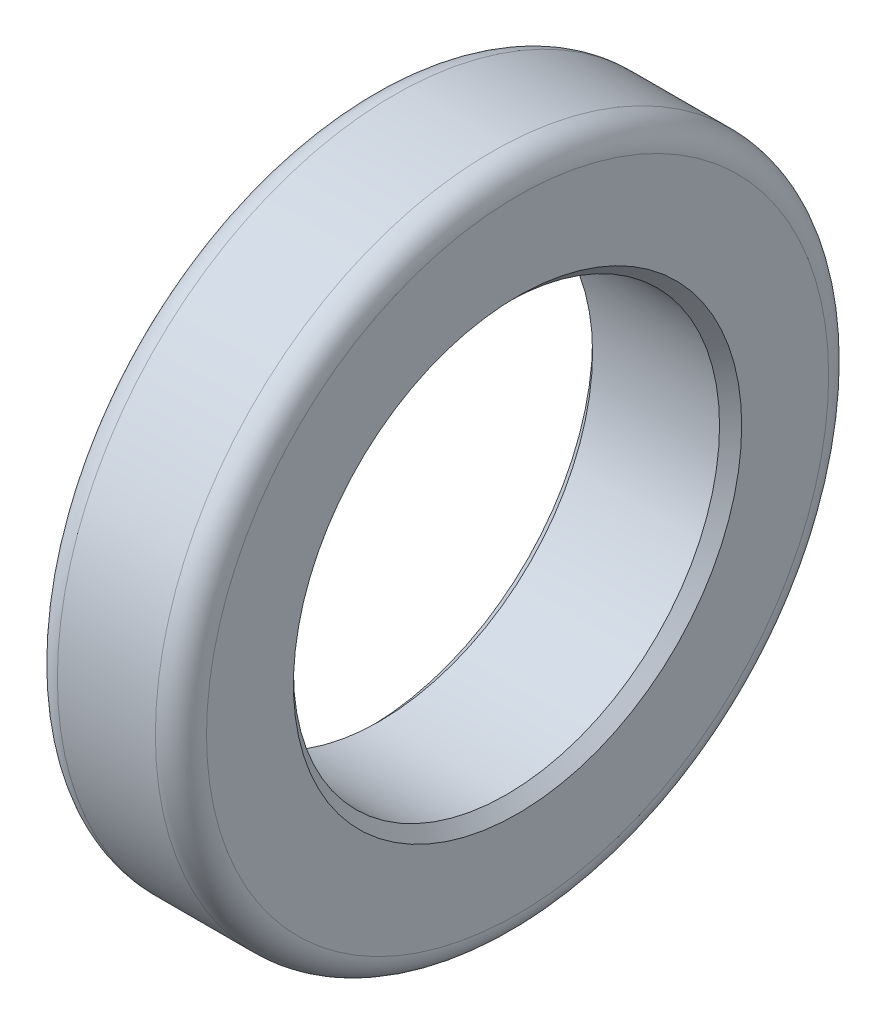
ISO-10303-21;
HEADER;
FILE_DESCRIPTION(('STEP AP214'),'2;1');
FILE_NAME('part.step','',(''),(''),'','','');
FILE_SCHEMA(('AUTOMOTIVE_DESIGN { 1 0 10303 214 1 1 1 1 }'));
ENDSEC;
DATA;
#1=APPLICATION_CONTEXT('core data for automotive mechanical design processes');
#2=APPLICATION_PROTOCOL_DEFINITION('international standard','automotive_design',2000,#1);
#3=PRODUCT_CONTEXT('',#1,'mechanical');
#4=PRODUCT('Part','Part','',(#3));
#5=PRODUCT_RELATED_PRODUCT_CATEGORY('part','',(#4));
#6=PRODUCT_DEFINITION_FORMATION('','',#4);
#7=PRODUCT_DEFINITION_CONTEXT('part definition',#1,'design');
#8=PRODUCT_DEFINITION('design','',#6,#7);
#9=PRODUCT_DEFINITION_SHAPE('','',#8);
#10=(LENGTH_UNIT() NAMED_UNIT(*) SI_UNIT(.MILLI.,.METRE.));
#11=(NAMED_UNIT(*) PLANE_ANGLE_UNIT() SI_UNIT($,.RADIAN.));
#12=(NAMED_UNIT(*) SI_UNIT($,.STERADIAN.) SOLID_ANGLE_UNIT());
#13=UNCERTAINTY_MEASURE_WITH_UNIT(LENGTH_MEASURE(1.E-05),#10,'distance_accuracy_value','');
#14=(GEOMETRIC_REPRESENTATION_CONTEXT(3) GLOBAL_UNCERTAINTY_ASSIGNED_CONTEXT((#13)) GLOBAL_UNIT_ASSIGNED_CONTEXT((#10,
#11,#12)) REPRESENTATION_CONTEXT('',''));
#15=CARTESIAN_POINT('',(0.,0.,0.));
#16=DIRECTION('',(0.,0.,1.));
#17=DIRECTION('',(1.,0.,0.));
#18=AXIS2_PLACEMENT_3D('',#15,#16,#17);
#19=CARTESIAN_POINT('',(8.75,0.,0.));
#20=DIRECTION('',(1.,0.,0.));
#21=DIRECTION('',(0.,0.,-1.));
#22=AXIS2_PLACEMENT_3D('',#19,#20,#21);
#23=PLANE('',#22);
#24=CARTESIAN_POINT('',(8.75,0.,0.));
#25=DIRECTION('',(1.,0.,0.));
#26=DIRECTION('',(0.,0.,-1.));
#27=AXIS2_PLACEMENT_3D('',#24,#25,#26);
#28=CIRCLE('',#27,26.3);
#29=CARTESIAN_POINT('',(8.75,0.,-26.3));
#30=VERTEX_POINT('',#29);
#31=EDGE_CURVE('E10',#30,#30,#28,.F.);
#32=ORIENTED_EDGE('',*,*,#31,.T.);
#33=EDGE_LOOP('',(#32));
#34=FACE_BOUND('',#33,.T.);
#35=CARTESIAN_POINT('',(8.75,0.,0.));
#36=DIRECTION('',(1.,0.,0.));
#37=DIRECTION('',(0.,0.,-1.));
#38=AXIS2_PLACEMENT_3D('',#35,#36,#37);
#39=CIRCLE('',#38,36.5);
#40=CARTESIAN_POINT('',(8.75,0.,-36.5));
#41=VERTEX_POINT('',#40);
#42=EDGE_CURVE('E68',#41,#41,#39,.T.);
#43=ORIENTED_EDGE('',*,*,#42,.T.);
#44=EDGE_LOOP('',(#43));
#45=FACE_BOUND('',#44,.T.);
#46=ADVANCED_FACE('F38',(#34,#45),#23,.T.);
#47=CARTESIAN_POINT('',(-8.75,0.,0.));
#48=DIRECTION('',(1.,0.,0.));
#49=DIRECTION('',(0.,0.,-1.));
#50=AXIS2_PLACEMENT_3D('',#47,#48,#49);
#51=PLANE('',#50);
#52=CARTESIAN_POINT('',(-8.75,0.,0.));
#53=DIRECTION('',(1.,0.,0.));
#54=DIRECTION('',(0.,0.,-1.));
#55=AXIS2_PLACEMENT_3D('',#52,#53,#54);
#56=CIRCLE('',#55,26.3);
#57=CARTESIAN_POINT('',(-8.75,0.,-26.3));
#58=VERTEX_POINT('',#57);
#59=EDGE_CURVE('E54',#58,#58,#56,.T.);
#60=ORIENTED_EDGE('',*,*,#59,.T.);
#61=EDGE_LOOP('',(#60));
#62=FACE_BOUND('',#61,.T.);
#63=CARTESIAN_POINT('',(-8.75,0.,0.));
#64=DIRECTION('',(1.,0.,0.));
#65=DIRECTION('',(0.,0.,-1.));
#66=AXIS2_PLACEMENT_3D('',#63,#64,#65);
#67=CIRCLE('',#66,36.5);
#68=CARTESIAN_POINT('',(-8.75,0.,-36.5));
#69=VERTEX_POINT('',#68);
#70=EDGE_CURVE('E59',#69,#69,#67,.F.);
#71=ORIENTED_EDGE('',*,*,#70,.T.);
#72=EDGE_LOOP('',(#71));
#73=FACE_BOUND('',#72,.T.);
#74=ADVANCED_FACE('F91',(#62,#73),#51,.F.);
#75=CARTESIAN_POINT('',(8.75,0.,0.));
#76=DIRECTION('',(-1.,0.,0.));
#77=DIRECTION('',(0.,0.,1.));
#78=AXIS2_PLACEMENT_3D('',#75,#76,#77);
#79=CYLINDRICAL_SURFACE('',#78,39.5);
#80=CARTESIAN_POINT('',(5.75,0.,0.));
#81=DIRECTION('',(1.,0.,0.));
#82=DIRECTION('',(0.,0.,-1.));
#83=AXIS2_PLACEMENT_3D('',#80,#81,#82);
#84=CIRCLE('',#83,39.5);
#85=CARTESIAN_POINT('',(5.75,0.,-39.5));
#86=VERTEX_POINT('',#85);
#87=EDGE_CURVE('E62',#86,#86,#84,.F.);
#88=ORIENTED_EDGE('',*,*,#87,.T.);
#89=EDGE_LOOP('',(#88));
#90=FACE_BOUND('',#89,.T.);
#91=CARTESIAN_POINT('',(-5.75,0.,0.));
#92=DIRECTION('',(1.,0.,0.));
#93=DIRECTION('',(0.,0.,-1.));
#94=AXIS2_PLACEMENT_3D('',#91,#92,#93);
#95=CIRCLE('',#94,39.5);
#96=CARTESIAN_POINT('',(-5.75,0.,-39.5));
#97=VERTEX_POINT('',#96);
#98=EDGE_CURVE('E65',#97,#97,#95,.T.);
#99=ORIENTED_EDGE('',*,*,#98,.T.);
#100=EDGE_LOOP('',(#99));
#101=FACE_BOUND('',#100,.T.);
#102=ADVANCED_FACE('F86',(#90,#101),#79,.T.);
#103=CARTESIAN_POINT('',(8.75,0.,0.));
#104=DIRECTION('',(-1.,0.,0.));
#105=DIRECTION('',(0.,0.,1.));
#106=AXIS2_PLACEMENT_3D('',#103,#104,#105);
#107=CYLINDRICAL_SURFACE('',#106,25.);
#108=CARTESIAN_POINT('',(-7.44999999999998,0.,0.));
#109=DIRECTION('',(1.,0.,0.));
#110=DIRECTION('',(0.,0.,-1.));
#111=AXIS2_PLACEMENT_3D('',#108,#109,#110);
#112=CIRCLE('',#111,25.);
#113=CARTESIAN_POINT('',(-7.44999999999998,0.,-25.));
#114=VERTEX_POINT('',#113);
#115=EDGE_CURVE('E46',#114,#114,#112,.F.);
#116=ORIENTED_EDGE('',*,*,#115,.T.);
#117=EDGE_LOOP('',(#116));
#118=FACE_BOUND('',#117,.T.);
#119=CARTESIAN_POINT('',(7.44999999999997,0.,0.));
#120=DIRECTION('',(1.,0.,0.));
#121=DIRECTION('',(0.,0.,-1.));
#122=AXIS2_PLACEMENT_3D('',#119,#120,#121);
#123=CIRCLE('',#122,25.);
#124=CARTESIAN_POINT('',(7.44999999999997,0.,-25.));
#125=VERTEX_POINT('',#124);
#126=EDGE_CURVE('E50',#125,#125,#123,.T.);
#127=ORIENTED_EDGE('',*,*,#126,.T.);
#128=EDGE_LOOP('',(#127));
#129=FACE_BOUND('',#128,.T.);
#130=ADVANCED_FACE('F76',(#118,#129),#107,.F.);
#131=CARTESIAN_POINT('',(5.75,0.,0.));
#132=DIRECTION('',(1.,0.,0.));
#133=DIRECTION('',(0.,0.,-1.));
#134=AXIS2_PLACEMENT_3D('',#131,#132,#133);
#135=TOROIDAL_SURFACE('',#134,36.5,3.);
#136=ORIENTED_EDGE('',*,*,#87,.F.);
#137=EDGE_LOOP('',(#136));
#138=FACE_BOUND('',#137,.T.);
#139=ORIENTED_EDGE('',*,*,#42,.F.);
#140=EDGE_LOOP('',(#139));
#141=FACE_BOUND('',#140,.T.);
#142=ADVANCED_FACE('F73',(#138,#141),#135,.T.);
#143=CARTESIAN_POINT('',(-5.75,0.,0.));
#144=DIRECTION('',(1.,0.,0.));
#145=DIRECTION('',(0.,0.,-1.));
#146=AXIS2_PLACEMENT_3D('',#143,#144,#145);
#147=TOROIDAL_SURFACE('',#146,36.5,3.);
#148=ORIENTED_EDGE('',*,*,#70,.F.);
#149=EDGE_LOOP('',(#148));
#150=FACE_BOUND('',#149,.T.);
#151=ORIENTED_EDGE('',*,*,#98,.F.);
#152=EDGE_LOOP('',(#151));
#153=FACE_BOUND('',#152,.T.);
#154=ADVANCED_FACE('F75',(#150,#153),#147,.T.);
#155=CARTESIAN_POINT('',(-8.75,0.,0.));
#156=DIRECTION('',(-1.,0.,0.));
#157=DIRECTION('',(0.,0.,1.));
#158=AXIS2_PLACEMENT_3D('',#155,#156,#157);
#159=CONICAL_SURFACE('',#158,26.3,0.785398163397448);
#160=ORIENTED_EDGE('',*,*,#115,.F.);
#161=EDGE_LOOP('',(#160));
#162=FACE_BOUND('',#161,.T.);
#163=ORIENTED_EDGE('',*,*,#59,.F.);
#164=EDGE_LOOP('',(#163));
#165=FACE_BOUND('',#164,.T.);
#166=ADVANCED_FACE('F83',(#162,#165),#159,.F.);
#167=CARTESIAN_POINT('',(7.44999999999997,0.,0.));
#168=DIRECTION('',(1.,0.,0.));
#169=DIRECTION('',(0.,0.,-1.));
#170=AXIS2_PLACEMENT_3D('',#167,#168,#169);
#171=CONICAL_SURFACE('',#170,25.,0.78539816339745);
#172=ORIENTED_EDGE('',*,*,#31,.F.);
#173=EDGE_LOOP('',(#172));
#174=FACE_BOUND('',#173,.T.);
#175=ORIENTED_EDGE('',*,*,#126,.F.);
#176=EDGE_LOOP('',(#175));
#177=FACE_BOUND('',#176,.T.);
#178=ADVANCED_FACE('F41',(#174,#177),#171,.F.);
#179=CLOSED_SHELL('',(#46,#74,#102,#130,#142,#154,#166,#178));
#180=MANIFOLD_SOLID_BREP('B2',#179);
#181=ADVANCED_BREP_SHAPE_REPRESENTATION('',(#18,#180),#14);
#182=SHAPE_DEFINITION_REPRESENTATION(#9,#181);
ENDSEC;
END-ISO-10303-21;
